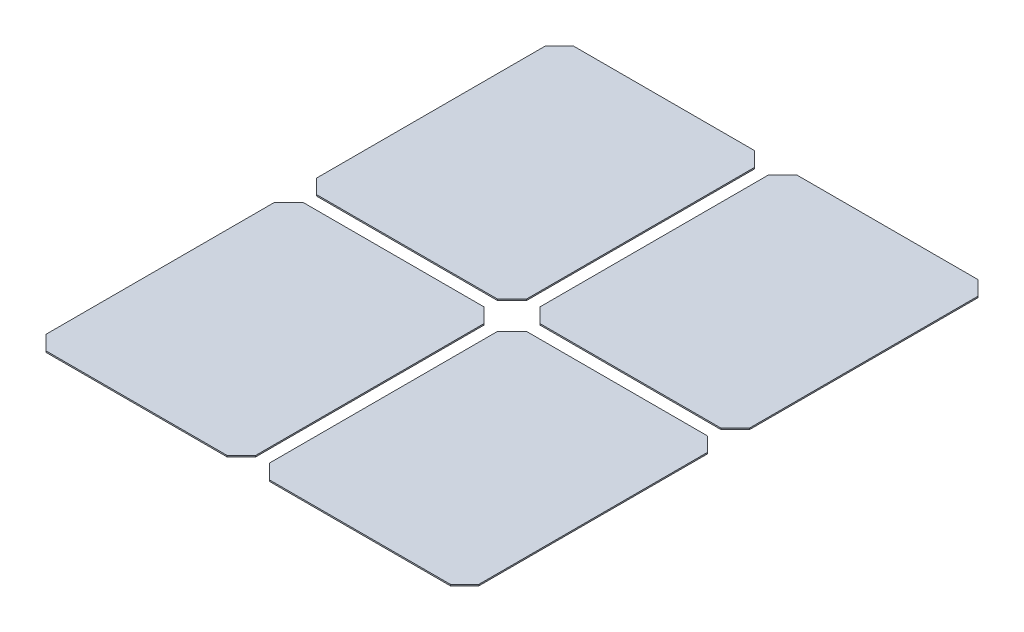
ISO-10303-21;
HEADER;
FILE_DESCRIPTION(('STEP AP214'),'2;1');
FILE_NAME('part.step','',(''),(''),'','','');
FILE_SCHEMA(('AUTOMOTIVE_DESIGN { 1 0 10303 214 1 1 1 1 }'));
ENDSEC;
DATA;
#1=APPLICATION_CONTEXT('core data for automotive mechanical design processes');
#2=APPLICATION_PROTOCOL_DEFINITION('international standard','automotive_design',2000,#1);
#3=PRODUCT_CONTEXT('',#1,'mechanical');
#4=PRODUCT('Part','Part','',(#3));
#5=PRODUCT_RELATED_PRODUCT_CATEGORY('part','',(#4));
#6=PRODUCT_DEFINITION_FORMATION('','',#4);
#7=PRODUCT_DEFINITION_CONTEXT('part definition',#1,'design');
#8=PRODUCT_DEFINITION('design','',#6,#7);
#9=PRODUCT_DEFINITION_SHAPE('','',#8);
#10=(LENGTH_UNIT() NAMED_UNIT(*) SI_UNIT(.MILLI.,.METRE.));
#11=(NAMED_UNIT(*) PLANE_ANGLE_UNIT() SI_UNIT($,.RADIAN.));
#12=(NAMED_UNIT(*) SI_UNIT($,.STERADIAN.) SOLID_ANGLE_UNIT());
#13=UNCERTAINTY_MEASURE_WITH_UNIT(LENGTH_MEASURE(1.E-05),#10,'distance_accuracy_value','');
#14=(GEOMETRIC_REPRESENTATION_CONTEXT(3) GLOBAL_UNCERTAINTY_ASSIGNED_CONTEXT((#13)) GLOBAL_UNIT_ASSIGNED_CONTEXT((#10,
#11,#12)) REPRESENTATION_CONTEXT('',''));
#15=CARTESIAN_POINT('',(0.,0.,0.));
#16=DIRECTION('',(0.,0.,1.));
#17=DIRECTION('',(1.,0.,0.));
#18=AXIS2_PLACEMENT_3D('',#15,#16,#17);
#19=CARTESIAN_POINT('',(-168.000000000001,1.,-233.606601717798));
#20=DIRECTION('',(1.,0.,0.));
#21=DIRECTION('',(0.,0.,-1.));
#22=AXIS2_PLACEMENT_3D('',#19,#20,#21);
#23=PLANE('',#22);
#24=DIRECTION('',(0.,0.,1.));
#25=VECTOR('',#24,1.);
#26=CARTESIAN_POINT('',(-168.000000000001,0.,-233.606601717798));
#27=LINE('',#26,#25);
#28=CARTESIAN_POINT('',(-168.000000000001,0.,-402.393398282201));
#29=VERTEX_POINT('',#28);
#30=CARTESIAN_POINT('',(-168.000000000001,0.,-233.606601717798));
#31=VERTEX_POINT('',#30);
#32=EDGE_CURVE('E139',#29,#31,#27,.T.);
#33=ORIENTED_EDGE('',*,*,#32,.T.);
#34=DIRECTION('',(0.,-1.,0.));
#35=VECTOR('',#34,1.);
#36=CARTESIAN_POINT('',(-168.000000000001,1.,-233.606601717798));
#37=LINE('',#36,#35);
#38=CARTESIAN_POINT('',(-168.000000000001,1.,-233.606601717798));
#39=VERTEX_POINT('',#38);
#40=EDGE_CURVE('E12',#39,#31,#37,.T.);
#41=ORIENTED_EDGE('',*,*,#40,.F.);
#42=DIRECTION('',(0.,0.,1.));
#43=VECTOR('',#42,1.);
#44=CARTESIAN_POINT('',(-168.000000000001,1.,-233.606601717798));
#45=LINE('',#44,#43);
#46=CARTESIAN_POINT('',(-168.000000000001,1.,-402.393398282201));
#47=VERTEX_POINT('',#46);
#48=EDGE_CURVE('E153',#47,#39,#45,.T.);
#49=ORIENTED_EDGE('',*,*,#48,.F.);
#50=DIRECTION('',(0.,-1.,0.));
#51=VECTOR('',#50,1.);
#52=CARTESIAN_POINT('',(-168.000000000001,1.,-402.393398282201));
#53=LINE('',#52,#51);
#54=EDGE_CURVE('E135',#47,#29,#53,.T.);
#55=ORIENTED_EDGE('',*,*,#54,.T.);
#56=EDGE_LOOP('',(#33,#41,#49,#55));
#57=FACE_BOUND('',#56,.T.);
#58=ADVANCED_FACE('F43',(#57),#23,.F.);
#59=CARTESIAN_POINT('',(-157.393398282203,1.,-223.));
#60=DIRECTION('',(0.70710678118655,0.,-0.707106781186545));
#61=DIRECTION('',(-0.707106781186545,0.,-0.70710678118655));
#62=AXIS2_PLACEMENT_3D('',#59,#60,#61);
#63=PLANE('',#62);
#64=DIRECTION('',(0.707106781186545,0.,0.70710678118655));
#65=VECTOR('',#64,1.);
#66=CARTESIAN_POINT('',(-157.393398282203,0.,-223.));
#67=LINE('',#66,#65);
#68=CARTESIAN_POINT('',(-157.393398282203,0.,-223.));
#69=VERTEX_POINT('',#68);
#70=EDGE_CURVE('E142',#31,#69,#67,.T.);
#71=ORIENTED_EDGE('',*,*,#70,.T.);
#72=DIRECTION('',(0.,-1.,0.));
#73=VECTOR('',#72,1.);
#74=CARTESIAN_POINT('',(-157.393398282203,1.,-223.));
#75=LINE('',#74,#73);
#76=CARTESIAN_POINT('',(-157.393398282203,1.,-223.));
#77=VERTEX_POINT('',#76);
#78=EDGE_CURVE('E51',#77,#69,#75,.T.);
#79=ORIENTED_EDGE('',*,*,#78,.F.);
#80=DIRECTION('',(0.707106781186545,0.,0.70710678118655));
#81=VECTOR('',#80,1.);
#82=CARTESIAN_POINT('',(-157.393398282203,1.,-223.));
#83=LINE('',#82,#81);
#84=EDGE_CURVE('E102',#39,#77,#83,.T.);
#85=ORIENTED_EDGE('',*,*,#84,.F.);
#86=ORIENTED_EDGE('',*,*,#40,.T.);
#87=EDGE_LOOP('',(#71,#79,#85,#86));
#88=FACE_BOUND('',#87,.T.);
#89=ADVANCED_FACE('F188',(#88),#63,.F.);
#90=CARTESIAN_POINT('',(-23.606601717799,1.,-223.));
#91=DIRECTION('',(0.,0.,-1.));
#92=DIRECTION('',(-1.,0.,0.));
#93=AXIS2_PLACEMENT_3D('',#90,#91,#92);
#94=PLANE('',#93);
#95=DIRECTION('',(1.,0.,0.));
#96=VECTOR('',#95,1.);
#97=CARTESIAN_POINT('',(-23.606601717799,0.,-223.));
#98=LINE('',#97,#96);
#99=CARTESIAN_POINT('',(-23.606601717799,0.,-223.));
#100=VERTEX_POINT('',#99);
#101=EDGE_CURVE('E144',#69,#100,#98,.T.);
#102=ORIENTED_EDGE('',*,*,#101,.T.);
#103=DIRECTION('',(0.,-1.,0.));
#104=VECTOR('',#103,1.);
#105=CARTESIAN_POINT('',(-23.606601717799,1.,-223.));
#106=LINE('',#105,#104);
#107=CARTESIAN_POINT('',(-23.606601717799,1.,-223.));
#108=VERTEX_POINT('',#107);
#109=EDGE_CURVE('E160',#108,#100,#106,.T.);
#110=ORIENTED_EDGE('',*,*,#109,.F.);
#111=DIRECTION('',(1.,0.,0.));
#112=VECTOR('',#111,1.);
#113=CARTESIAN_POINT('',(-23.606601717799,1.,-223.));
#114=LINE('',#113,#112);
#115=EDGE_CURVE('E168',#77,#108,#114,.T.);
#116=ORIENTED_EDGE('',*,*,#115,.F.);
#117=ORIENTED_EDGE('',*,*,#78,.T.);
#118=EDGE_LOOP('',(#102,#110,#116,#117));
#119=FACE_BOUND('',#118,.T.);
#120=ADVANCED_FACE('F166',(#119),#94,.F.);
#121=CARTESIAN_POINT('',(-13.0000000000007,1.,-233.606601717798));
#122=DIRECTION('',(-0.707106781186542,0.,-0.707106781186553));
#123=DIRECTION('',(-0.707106781186553,0.,0.707106781186542));
#124=AXIS2_PLACEMENT_3D('',#121,#122,#123);
#125=PLANE('',#124);
#126=DIRECTION('',(0.707106781186553,0.,-0.707106781186542));
#127=VECTOR('',#126,1.);
#128=CARTESIAN_POINT('',(-13.0000000000007,0.,-233.606601717798));
#129=LINE('',#128,#127);
#130=CARTESIAN_POINT('',(-13.0000000000007,0.,-233.606601717798));
#131=VERTEX_POINT('',#130);
#132=EDGE_CURVE('E146',#100,#131,#129,.T.);
#133=ORIENTED_EDGE('',*,*,#132,.T.);
#134=DIRECTION('',(0.,-1.,0.));
#135=VECTOR('',#134,1.);
#136=CARTESIAN_POINT('',(-13.0000000000007,1.,-233.606601717798));
#137=LINE('',#136,#135);
#138=CARTESIAN_POINT('',(-13.0000000000007,1.,-233.606601717798));
#139=VERTEX_POINT('',#138);
#140=EDGE_CURVE('E157',#139,#131,#137,.T.);
#141=ORIENTED_EDGE('',*,*,#140,.F.);
#142=DIRECTION('',(0.707106781186553,0.,-0.707106781186542));
#143=VECTOR('',#142,1.);
#144=CARTESIAN_POINT('',(-13.0000000000007,1.,-233.606601717798));
#145=LINE('',#144,#143);
#146=EDGE_CURVE('E180',#108,#139,#145,.T.);
#147=ORIENTED_EDGE('',*,*,#146,.F.);
#148=ORIENTED_EDGE('',*,*,#109,.T.);
#149=EDGE_LOOP('',(#133,#141,#147,#148));
#150=FACE_BOUND('',#149,.T.);
#151=ADVANCED_FACE('F176',(#150),#125,.F.);
#152=CARTESIAN_POINT('',(-13.0000000000007,1.,-402.393398282202));
#153=DIRECTION('',(-1.,0.,0.));
#154=DIRECTION('',(0.,0.,1.));
#155=AXIS2_PLACEMENT_3D('',#152,#153,#154);
#156=PLANE('',#155);
#157=DIRECTION('',(0.,0.,-1.));
#158=VECTOR('',#157,1.);
#159=CARTESIAN_POINT('',(-13.0000000000007,0.,-402.393398282202));
#160=LINE('',#159,#158);
#161=CARTESIAN_POINT('',(-13.0000000000007,0.,-402.393398282202));
#162=VERTEX_POINT('',#161);
#163=EDGE_CURVE('E148',#131,#162,#160,.T.);
#164=ORIENTED_EDGE('',*,*,#163,.T.);
#165=DIRECTION('',(0.,-1.,0.));
#166=VECTOR('',#165,1.);
#167=CARTESIAN_POINT('',(-13.0000000000007,1.,-402.393398282202));
#168=LINE('',#167,#166);
#169=CARTESIAN_POINT('',(-13.0000000000007,1.,-402.393398282202));
#170=VERTEX_POINT('',#169);
#171=EDGE_CURVE('E130',#170,#162,#168,.T.);
#172=ORIENTED_EDGE('',*,*,#171,.F.);
#173=DIRECTION('',(0.,0.,-1.));
#174=VECTOR('',#173,1.);
#175=CARTESIAN_POINT('',(-13.0000000000007,1.,-402.393398282202));
#176=LINE('',#175,#174);
#177=EDGE_CURVE('E121',#139,#170,#176,.T.);
#178=ORIENTED_EDGE('',*,*,#177,.F.);
#179=ORIENTED_EDGE('',*,*,#140,.T.);
#180=EDGE_LOOP('',(#164,#172,#178,#179));
#181=FACE_BOUND('',#180,.T.);
#182=ADVANCED_FACE('F179',(#181),#156,.F.);
#183=CARTESIAN_POINT('',(-23.6066017177989,1.,-413.));
#184=DIRECTION('',(-0.70710678118654,0.,0.707106781186556));
#185=DIRECTION('',(0.707106781186556,0.,0.70710678118654));
#186=AXIS2_PLACEMENT_3D('',#183,#184,#185);
#187=PLANE('',#186);
#188=DIRECTION('',(-0.707106781186556,0.,-0.70710678118654));
#189=VECTOR('',#188,1.);
#190=CARTESIAN_POINT('',(-23.6066017177989,0.,-413.));
#191=LINE('',#190,#189);
#192=CARTESIAN_POINT('',(-23.6066017177989,0.,-413.));
#193=VERTEX_POINT('',#192);
#194=EDGE_CURVE('E129',#162,#193,#191,.T.);
#195=ORIENTED_EDGE('',*,*,#194,.T.);
#196=DIRECTION('',(0.,-1.,0.));
#197=VECTOR('',#196,1.);
#198=CARTESIAN_POINT('',(-23.6066017177989,1.,-413.));
#199=LINE('',#198,#197);
#200=CARTESIAN_POINT('',(-23.6066017177989,1.,-413.));
#201=VERTEX_POINT('',#200);
#202=EDGE_CURVE('E126',#201,#193,#199,.T.);
#203=ORIENTED_EDGE('',*,*,#202,.F.);
#204=DIRECTION('',(-0.707106781186556,0.,-0.70710678118654));
#205=VECTOR('',#204,1.);
#206=CARTESIAN_POINT('',(-23.6066017177989,1.,-413.));
#207=LINE('',#206,#205);
#208=EDGE_CURVE('E115',#170,#201,#207,.T.);
#209=ORIENTED_EDGE('',*,*,#208,.F.);
#210=ORIENTED_EDGE('',*,*,#171,.T.);
#211=EDGE_LOOP('',(#195,#203,#209,#210));
#212=FACE_BOUND('',#211,.T.);
#213=ADVANCED_FACE('F127',(#212),#187,.F.);
#214=CARTESIAN_POINT('',(-157.393398282202,1.,-413.));
#215=DIRECTION('',(0.,0.,1.));
#216=DIRECTION('',(1.,0.,0.));
#217=AXIS2_PLACEMENT_3D('',#214,#215,#216);
#218=PLANE('',#217);
#219=DIRECTION('',(-1.,0.,0.));
#220=VECTOR('',#219,1.);
#221=CARTESIAN_POINT('',(-157.393398282202,0.,-413.));
#222=LINE('',#221,#220);
#223=CARTESIAN_POINT('',(-157.393398282202,0.,-413.));
#224=VERTEX_POINT('',#223);
#225=EDGE_CURVE('E88',#193,#224,#222,.T.);
#226=ORIENTED_EDGE('',*,*,#225,.T.);
#227=DIRECTION('',(0.,-1.,0.));
#228=VECTOR('',#227,1.);
#229=CARTESIAN_POINT('',(-157.393398282202,1.,-413.));
#230=LINE('',#229,#228);
#231=CARTESIAN_POINT('',(-157.393398282202,1.,-413.));
#232=VERTEX_POINT('',#231);
#233=EDGE_CURVE('E131',#232,#224,#230,.T.);
#234=ORIENTED_EDGE('',*,*,#233,.F.);
#235=DIRECTION('',(-1.,0.,0.));
#236=VECTOR('',#235,1.);
#237=CARTESIAN_POINT('',(-157.393398282202,1.,-413.));
#238=LINE('',#237,#236);
#239=EDGE_CURVE('E119',#201,#232,#238,.T.);
#240=ORIENTED_EDGE('',*,*,#239,.F.);
#241=ORIENTED_EDGE('',*,*,#202,.T.);
#242=EDGE_LOOP('',(#226,#234,#240,#241));
#243=FACE_BOUND('',#242,.T.);
#244=ADVANCED_FACE('F133',(#243),#218,.F.);
#245=CARTESIAN_POINT('',(-168.000000000001,1.,-402.393398282201));
#246=DIRECTION('',(0.707106781186573,0.,0.707106781186522));
#247=DIRECTION('',(0.707106781186522,0.,-0.707106781186573));
#248=AXIS2_PLACEMENT_3D('',#245,#246,#247);
#249=PLANE('',#248);
#250=DIRECTION('',(-0.707106781186522,0.,0.707106781186573));
#251=VECTOR('',#250,1.);
#252=CARTESIAN_POINT('',(-168.000000000001,0.,-402.393398282201));
#253=LINE('',#252,#251);
#254=EDGE_CURVE('E94',#224,#29,#253,.T.);
#255=ORIENTED_EDGE('',*,*,#254,.T.);
#256=ORIENTED_EDGE('',*,*,#54,.F.);
#257=DIRECTION('',(-0.707106781186522,0.,0.707106781186573));
#258=VECTOR('',#257,1.);
#259=CARTESIAN_POINT('',(-168.000000000001,1.,-402.393398282201));
#260=LINE('',#259,#258);
#261=EDGE_CURVE('E59',#232,#47,#260,.T.);
#262=ORIENTED_EDGE('',*,*,#261,.F.);
#263=ORIENTED_EDGE('',*,*,#233,.T.);
#264=EDGE_LOOP('',(#255,#256,#262,#263));
#265=FACE_BOUND('',#264,.T.);
#266=ADVANCED_FACE('F204',(#265),#249,.F.);
#267=CARTESIAN_POINT('',(0.,1.,0.));
#268=DIRECTION('',(0.,-1.,0.));
#269=DIRECTION('',(0.,0.,-1.));
#270=AXIS2_PLACEMENT_3D('',#267,#268,#269);
#271=PLANE('',#270);
#272=ORIENTED_EDGE('',*,*,#48,.T.);
#273=ORIENTED_EDGE('',*,*,#84,.T.);
#274=ORIENTED_EDGE('',*,*,#115,.T.);
#275=ORIENTED_EDGE('',*,*,#146,.T.);
#276=ORIENTED_EDGE('',*,*,#177,.T.);
#277=ORIENTED_EDGE('',*,*,#208,.T.);
#278=ORIENTED_EDGE('',*,*,#239,.T.);
#279=ORIENTED_EDGE('',*,*,#261,.T.);
#280=EDGE_LOOP('',(#272,#273,#274,#275,#276,#277,#278,#279));
#281=FACE_BOUND('',#280,.T.);
#282=ADVANCED_FACE('F117',(#281),#271,.F.);
#283=CARTESIAN_POINT('',(0.,0.,0.));
#284=DIRECTION('',(0.,-1.,0.));
#285=DIRECTION('',(0.,0.,-1.));
#286=AXIS2_PLACEMENT_3D('',#283,#284,#285);
#287=PLANE('',#286);
#288=ORIENTED_EDGE('',*,*,#32,.F.);
#289=ORIENTED_EDGE('',*,*,#254,.F.);
#290=ORIENTED_EDGE('',*,*,#225,.F.);
#291=ORIENTED_EDGE('',*,*,#194,.F.);
#292=ORIENTED_EDGE('',*,*,#163,.F.);
#293=ORIENTED_EDGE('',*,*,#132,.F.);
#294=ORIENTED_EDGE('',*,*,#101,.F.);
#295=ORIENTED_EDGE('',*,*,#70,.F.);
#296=EDGE_LOOP('',(#288,#289,#290,#291,#292,#293,#294,#295));
#297=FACE_BOUND('',#296,.T.);
#298=ADVANCED_FACE('F172',(#297),#287,.T.);
#299=CLOSED_SHELL('',(#58,#89,#120,#151,#182,#213,#244,#266,#282,#298));
#300=MANIFOLD_SOLID_BREP('B2',#299);
#301=CARTESIAN_POINT('',(-333.000000000001,1.,-233.606601717797));
#302=DIRECTION('',(1.,0.,0.));
#303=DIRECTION('',(0.,0.,-1.));
#304=AXIS2_PLACEMENT_3D('',#301,#302,#303);
#305=PLANE('',#304);
#306=DIRECTION('',(0.,0.,1.));
#307=VECTOR('',#306,1.);
#308=CARTESIAN_POINT('',(-333.000000000001,0.,-233.606601717797));
#309=LINE('',#308,#307);
#310=CARTESIAN_POINT('',(-333.000000000001,0.,-402.3933982822));
#311=VERTEX_POINT('',#310);
#312=CARTESIAN_POINT('',(-333.000000000001,0.,-233.606601717797));
#313=VERTEX_POINT('',#312);
#314=EDGE_CURVE('E376',#311,#313,#309,.T.);
#315=ORIENTED_EDGE('',*,*,#314,.T.);
#316=DIRECTION('',(0.,-1.,0.));
#317=VECTOR('',#316,1.);
#318=CARTESIAN_POINT('',(-333.000000000001,1.,-233.606601717797));
#319=LINE('',#318,#317);
#320=CARTESIAN_POINT('',(-333.000000000001,1.,-233.606601717797));
#321=VERTEX_POINT('',#320);
#322=EDGE_CURVE('E41',#321,#313,#319,.T.);
#323=ORIENTED_EDGE('',*,*,#322,.F.);
#324=DIRECTION('',(0.,0.,1.));
#325=VECTOR('',#324,1.);
#326=CARTESIAN_POINT('',(-333.000000000001,1.,-233.606601717797));
#327=LINE('',#326,#325);
#328=CARTESIAN_POINT('',(-333.000000000001,1.,-402.3933982822));
#329=VERTEX_POINT('',#328);
#330=EDGE_CURVE('E390',#329,#321,#327,.T.);
#331=ORIENTED_EDGE('',*,*,#330,.F.);
#332=DIRECTION('',(0.,-1.,0.));
#333=VECTOR('',#332,1.);
#334=CARTESIAN_POINT('',(-333.000000000001,1.,-402.3933982822));
#335=LINE('',#334,#333);
#336=EDGE_CURVE('E372',#329,#311,#335,.T.);
#337=ORIENTED_EDGE('',*,*,#336,.T.);
#338=EDGE_LOOP('',(#315,#323,#331,#337));
#339=FACE_BOUND('',#338,.T.);
#340=ADVANCED_FACE('F280',(#339),#305,.F.);
#341=CARTESIAN_POINT('',(-322.393398282202,1.,-222.999999999999));
#342=DIRECTION('',(0.707106781186551,0.,-0.707106781186544));
#343=DIRECTION('',(-0.707106781186544,0.,-0.707106781186551));
#344=AXIS2_PLACEMENT_3D('',#341,#342,#343);
#345=PLANE('',#344);
#346=DIRECTION('',(0.707106781186544,0.,0.707106781186551));
#347=VECTOR('',#346,1.);
#348=CARTESIAN_POINT('',(-322.393398282202,0.,-222.999999999999));
#349=LINE('',#348,#347);
#350=CARTESIAN_POINT('',(-322.393398282202,0.,-222.999999999999));
#351=VERTEX_POINT('',#350);
#352=EDGE_CURVE('E379',#313,#351,#349,.T.);
#353=ORIENTED_EDGE('',*,*,#352,.T.);
#354=DIRECTION('',(0.,-1.,0.));
#355=VECTOR('',#354,1.);
#356=CARTESIAN_POINT('',(-322.393398282202,1.,-222.999999999999));
#357=LINE('',#356,#355);
#358=CARTESIAN_POINT('',(-322.393398282202,1.,-222.999999999999));
#359=VERTEX_POINT('',#358);
#360=EDGE_CURVE('E288',#359,#351,#357,.T.);
#361=ORIENTED_EDGE('',*,*,#360,.F.);
#362=DIRECTION('',(0.707106781186544,0.,0.707106781186551));
#363=VECTOR('',#362,1.);
#364=CARTESIAN_POINT('',(-322.393398282202,1.,-222.999999999999));
#365=LINE('',#364,#363);
#366=EDGE_CURVE('E339',#321,#359,#365,.T.);
#367=ORIENTED_EDGE('',*,*,#366,.F.);
#368=ORIENTED_EDGE('',*,*,#322,.T.);
#369=EDGE_LOOP('',(#353,#361,#367,#368));
#370=FACE_BOUND('',#369,.T.);
#371=ADVANCED_FACE('F425',(#370),#345,.F.);
#372=CARTESIAN_POINT('',(-188.606601717799,1.,-222.999999999999));
#373=DIRECTION('',(0.,0.,-1.));
#374=DIRECTION('',(-1.,0.,0.));
#375=AXIS2_PLACEMENT_3D('',#372,#373,#374);
#376=PLANE('',#375);
#377=DIRECTION('',(1.,0.,0.));
#378=VECTOR('',#377,1.);
#379=CARTESIAN_POINT('',(-188.606601717799,0.,-222.999999999999));
#380=LINE('',#379,#378);
#381=CARTESIAN_POINT('',(-188.606601717799,0.,-222.999999999999));
#382=VERTEX_POINT('',#381);
#383=EDGE_CURVE('E381',#351,#382,#380,.T.);
#384=ORIENTED_EDGE('',*,*,#383,.T.);
#385=DIRECTION('',(0.,-1.,0.));
#386=VECTOR('',#385,1.);
#387=CARTESIAN_POINT('',(-188.606601717799,1.,-222.999999999999));
#388=LINE('',#387,#386);
#389=CARTESIAN_POINT('',(-188.606601717799,1.,-222.999999999999));
#390=VERTEX_POINT('',#389);
#391=EDGE_CURVE('E397',#390,#382,#388,.T.);
#392=ORIENTED_EDGE('',*,*,#391,.F.);
#393=DIRECTION('',(1.,0.,0.));
#394=VECTOR('',#393,1.);
#395=CARTESIAN_POINT('',(-188.606601717799,1.,-222.999999999999));
#396=LINE('',#395,#394);
#397=EDGE_CURVE('E405',#359,#390,#396,.T.);
#398=ORIENTED_EDGE('',*,*,#397,.F.);
#399=ORIENTED_EDGE('',*,*,#360,.T.);
#400=EDGE_LOOP('',(#384,#392,#398,#399));
#401=FACE_BOUND('',#400,.T.);
#402=ADVANCED_FACE('F403',(#401),#376,.F.);
#403=CARTESIAN_POINT('',(-178.000000000001,1.,-233.606601717797));
#404=DIRECTION('',(-0.707106781186542,0.,-0.707106781186553));
#405=DIRECTION('',(-0.707106781186553,0.,0.707106781186542));
#406=AXIS2_PLACEMENT_3D('',#403,#404,#405);
#407=PLANE('',#406);
#408=DIRECTION('',(0.707106781186553,0.,-0.707106781186542));
#409=VECTOR('',#408,1.);
#410=CARTESIAN_POINT('',(-178.000000000001,0.,-233.606601717797));
#411=LINE('',#410,#409);
#412=CARTESIAN_POINT('',(-178.000000000001,0.,-233.606601717797));
#413=VERTEX_POINT('',#412);
#414=EDGE_CURVE('E383',#382,#413,#411,.T.);
#415=ORIENTED_EDGE('',*,*,#414,.T.);
#416=DIRECTION('',(0.,-1.,0.));
#417=VECTOR('',#416,1.);
#418=CARTESIAN_POINT('',(-178.000000000001,1.,-233.606601717797));
#419=LINE('',#418,#417);
#420=CARTESIAN_POINT('',(-178.000000000001,1.,-233.606601717797));
#421=VERTEX_POINT('',#420);
#422=EDGE_CURVE('E394',#421,#413,#419,.T.);
#423=ORIENTED_EDGE('',*,*,#422,.F.);
#424=DIRECTION('',(0.707106781186553,0.,-0.707106781186542));
#425=VECTOR('',#424,1.);
#426=CARTESIAN_POINT('',(-178.000000000001,1.,-233.606601717797));
#427=LINE('',#426,#425);
#428=EDGE_CURVE('E417',#390,#421,#427,.T.);
#429=ORIENTED_EDGE('',*,*,#428,.F.);
#430=ORIENTED_EDGE('',*,*,#391,.T.);
#431=EDGE_LOOP('',(#415,#423,#429,#430));
#432=FACE_BOUND('',#431,.T.);
#433=ADVANCED_FACE('F413',(#432),#407,.F.);
#434=CARTESIAN_POINT('',(-178.000000000001,1.,-402.393398282201));
#435=DIRECTION('',(-1.,0.,0.));
#436=DIRECTION('',(0.,0.,1.));
#437=AXIS2_PLACEMENT_3D('',#434,#435,#436);
#438=PLANE('',#437);
#439=DIRECTION('',(0.,0.,-1.));
#440=VECTOR('',#439,1.);
#441=CARTESIAN_POINT('',(-178.000000000001,0.,-402.393398282201));
#442=LINE('',#441,#440);
#443=CARTESIAN_POINT('',(-178.000000000001,0.,-402.393398282201));
#444=VERTEX_POINT('',#443);
#445=EDGE_CURVE('E385',#413,#444,#442,.T.);
#446=ORIENTED_EDGE('',*,*,#445,.T.);
#447=DIRECTION('',(0.,-1.,0.));
#448=VECTOR('',#447,1.);
#449=CARTESIAN_POINT('',(-178.000000000001,1.,-402.393398282201));
#450=LINE('',#449,#448);
#451=CARTESIAN_POINT('',(-178.000000000001,1.,-402.393398282201));
#452=VERTEX_POINT('',#451);
#453=EDGE_CURVE('E367',#452,#444,#450,.T.);
#454=ORIENTED_EDGE('',*,*,#453,.F.);
#455=DIRECTION('',(0.,0.,-1.));
#456=VECTOR('',#455,1.);
#457=CARTESIAN_POINT('',(-178.000000000001,1.,-402.393398282201));
#458=LINE('',#457,#456);
#459=EDGE_CURVE('E358',#421,#452,#458,.T.);
#460=ORIENTED_EDGE('',*,*,#459,.F.);
#461=ORIENTED_EDGE('',*,*,#422,.T.);
#462=EDGE_LOOP('',(#446,#454,#460,#461));
#463=FACE_BOUND('',#462,.T.);
#464=ADVANCED_FACE('F416',(#463),#438,.F.);
#465=CARTESIAN_POINT('',(-188.606601717799,1.,-412.999999999999));
#466=DIRECTION('',(-0.707106781186539,0.,0.707106781186556));
#467=DIRECTION('',(0.707106781186556,0.,0.707106781186539));
#468=AXIS2_PLACEMENT_3D('',#465,#466,#467);
#469=PLANE('',#468);
#470=DIRECTION('',(-0.707106781186556,0.,-0.707106781186539));
#471=VECTOR('',#470,1.);
#472=CARTESIAN_POINT('',(-188.606601717799,0.,-412.999999999999));
#473=LINE('',#472,#471);
#474=CARTESIAN_POINT('',(-188.606601717799,0.,-412.999999999999));
#475=VERTEX_POINT('',#474);
#476=EDGE_CURVE('E366',#444,#475,#473,.T.);
#477=ORIENTED_EDGE('',*,*,#476,.T.);
#478=DIRECTION('',(0.,-1.,0.));
#479=VECTOR('',#478,1.);
#480=CARTESIAN_POINT('',(-188.606601717799,1.,-412.999999999999));
#481=LINE('',#480,#479);
#482=CARTESIAN_POINT('',(-188.606601717799,1.,-412.999999999999));
#483=VERTEX_POINT('',#482);
#484=EDGE_CURVE('E363',#483,#475,#481,.T.);
#485=ORIENTED_EDGE('',*,*,#484,.F.);
#486=DIRECTION('',(-0.707106781186556,0.,-0.707106781186539));
#487=VECTOR('',#486,1.);
#488=CARTESIAN_POINT('',(-188.606601717799,1.,-412.999999999999));
#489=LINE('',#488,#487);
#490=EDGE_CURVE('E352',#452,#483,#489,.T.);
#491=ORIENTED_EDGE('',*,*,#490,.F.);
#492=ORIENTED_EDGE('',*,*,#453,.T.);
#493=EDGE_LOOP('',(#477,#485,#491,#492));
#494=FACE_BOUND('',#493,.T.);
#495=ADVANCED_FACE('F364',(#494),#469,.F.);
#496=CARTESIAN_POINT('',(-322.393398282202,1.,-412.999999999999));
#497=DIRECTION('',(0.,0.,1.));
#498=DIRECTION('',(1.,0.,0.));
#499=AXIS2_PLACEMENT_3D('',#496,#497,#498);
#500=PLANE('',#499);
#501=DIRECTION('',(-1.,0.,0.));
#502=VECTOR('',#501,1.);
#503=CARTESIAN_POINT('',(-322.393398282202,0.,-412.999999999999));
#504=LINE('',#503,#502);
#505=CARTESIAN_POINT('',(-322.393398282202,0.,-412.999999999999));
#506=VERTEX_POINT('',#505);
#507=EDGE_CURVE('E325',#475,#506,#504,.T.);
#508=ORIENTED_EDGE('',*,*,#507,.T.);
#509=DIRECTION('',(0.,-1.,0.));
#510=VECTOR('',#509,1.);
#511=CARTESIAN_POINT('',(-322.393398282202,1.,-412.999999999999));
#512=LINE('',#511,#510);
#513=CARTESIAN_POINT('',(-322.393398282202,1.,-412.999999999999));
#514=VERTEX_POINT('',#513);
#515=EDGE_CURVE('E368',#514,#506,#512,.T.);
#516=ORIENTED_EDGE('',*,*,#515,.F.);
#517=DIRECTION('',(-1.,0.,0.));
#518=VECTOR('',#517,1.);
#519=CARTESIAN_POINT('',(-322.393398282202,1.,-412.999999999999));
#520=LINE('',#519,#518);
#521=EDGE_CURVE('E356',#483,#514,#520,.T.);
#522=ORIENTED_EDGE('',*,*,#521,.F.);
#523=ORIENTED_EDGE('',*,*,#484,.T.);
#524=EDGE_LOOP('',(#508,#516,#522,#523));
#525=FACE_BOUND('',#524,.T.);
#526=ADVANCED_FACE('F370',(#525),#500,.F.);
#527=CARTESIAN_POINT('',(-333.000000000001,1.,-402.3933982822));
#528=DIRECTION('',(0.707106781186575,0.,0.70710678118652));
#529=DIRECTION('',(0.70710678118652,0.,-0.707106781186575));
#530=AXIS2_PLACEMENT_3D('',#527,#528,#529);
#531=PLANE('',#530);
#532=DIRECTION('',(-0.70710678118652,0.,0.707106781186575));
#533=VECTOR('',#532,1.);
#534=CARTESIAN_POINT('',(-333.000000000001,0.,-402.3933982822));
#535=LINE('',#534,#533);
#536=EDGE_CURVE('E331',#506,#311,#535,.T.);
#537=ORIENTED_EDGE('',*,*,#536,.T.);
#538=ORIENTED_EDGE('',*,*,#336,.F.);
#539=DIRECTION('',(-0.70710678118652,0.,0.707106781186575));
#540=VECTOR('',#539,1.);
#541=CARTESIAN_POINT('',(-333.000000000001,1.,-402.3933982822));
#542=LINE('',#541,#540);
#543=EDGE_CURVE('E296',#514,#329,#542,.T.);
#544=ORIENTED_EDGE('',*,*,#543,.F.);
#545=ORIENTED_EDGE('',*,*,#515,.T.);
#546=EDGE_LOOP('',(#537,#538,#544,#545));
#547=FACE_BOUND('',#546,.T.);
#548=ADVANCED_FACE('F441',(#547),#531,.F.);
#549=CARTESIAN_POINT('',(0.,1.,0.));
#550=DIRECTION('',(0.,-1.,0.));
#551=DIRECTION('',(0.,0.,-1.));
#552=AXIS2_PLACEMENT_3D('',#549,#550,#551);
#553=PLANE('',#552);
#554=ORIENTED_EDGE('',*,*,#330,.T.);
#555=ORIENTED_EDGE('',*,*,#366,.T.);
#556=ORIENTED_EDGE('',*,*,#397,.T.);
#557=ORIENTED_EDGE('',*,*,#428,.T.);
#558=ORIENTED_EDGE('',*,*,#459,.T.);
#559=ORIENTED_EDGE('',*,*,#490,.T.);
#560=ORIENTED_EDGE('',*,*,#521,.T.);
#561=ORIENTED_EDGE('',*,*,#543,.T.);
#562=EDGE_LOOP('',(#554,#555,#556,#557,#558,#559,#560,#561));
#563=FACE_BOUND('',#562,.T.);
#564=ADVANCED_FACE('F354',(#563),#553,.F.);
#565=CARTESIAN_POINT('',(0.,0.,0.));
#566=DIRECTION('',(0.,-1.,0.));
#567=DIRECTION('',(0.,0.,-1.));
#568=AXIS2_PLACEMENT_3D('',#565,#566,#567);
#569=PLANE('',#568);
#570=ORIENTED_EDGE('',*,*,#314,.F.);
#571=ORIENTED_EDGE('',*,*,#536,.F.);
#572=ORIENTED_EDGE('',*,*,#507,.F.);
#573=ORIENTED_EDGE('',*,*,#476,.F.);
#574=ORIENTED_EDGE('',*,*,#445,.F.);
#575=ORIENTED_EDGE('',*,*,#414,.F.);
#576=ORIENTED_EDGE('',*,*,#383,.F.);
#577=ORIENTED_EDGE('',*,*,#352,.F.);
#578=EDGE_LOOP('',(#570,#571,#572,#573,#574,#575,#576,#577));
#579=FACE_BOUND('',#578,.T.);
#580=ADVANCED_FACE('F409',(#579),#569,.T.);
#581=CLOSED_SHELL('',(#340,#371,#402,#433,#464,#495,#526,#548,#564,#580));
#582=MANIFOLD_SOLID_BREP('B6',#581);
#583=CARTESIAN_POINT('',(-333.,1.,-33.6066017177971));
#584=DIRECTION('',(1.,0.,0.));
#585=DIRECTION('',(0.,0.,-1.));
#586=AXIS2_PLACEMENT_3D('',#583,#584,#585);
#587=PLANE('',#586);
#588=DIRECTION('',(0.,0.,1.));
#589=VECTOR('',#588,1.);
#590=CARTESIAN_POINT('',(-333.,0.,-33.6066017177971));
#591=LINE('',#590,#589);
#592=CARTESIAN_POINT('',(-333.,0.,-202.3933982822));
#593=VERTEX_POINT('',#592);
#594=CARTESIAN_POINT('',(-333.,0.,-33.6066017177971));
#595=VERTEX_POINT('',#594);
#596=EDGE_CURVE('E612',#593,#595,#591,.T.);
#597=ORIENTED_EDGE('',*,*,#596,.T.);
#598=DIRECTION('',(0.,-1.,0.));
#599=VECTOR('',#598,1.);
#600=CARTESIAN_POINT('',(-333.,1.,-33.6066017177971));
#601=LINE('',#600,#599);
#602=CARTESIAN_POINT('',(-333.,1.,-33.6066017177971));
#603=VERTEX_POINT('',#602);
#604=EDGE_CURVE('E278',#603,#595,#601,.T.);
#605=ORIENTED_EDGE('',*,*,#604,.F.);
#606=DIRECTION('',(0.,0.,1.));
#607=VECTOR('',#606,1.);
#608=CARTESIAN_POINT('',(-333.,1.,-33.6066017177971));
#609=LINE('',#608,#607);
#610=CARTESIAN_POINT('',(-333.,1.,-202.3933982822));
#611=VERTEX_POINT('',#610);
#612=EDGE_CURVE('E626',#611,#603,#609,.T.);
#613=ORIENTED_EDGE('',*,*,#612,.F.);
#614=DIRECTION('',(0.,-1.,0.));
#615=VECTOR('',#614,1.);
#616=CARTESIAN_POINT('',(-333.,1.,-202.3933982822));
#617=LINE('',#616,#615);
#618=EDGE_CURVE('E608',#611,#593,#617,.T.);
#619=ORIENTED_EDGE('',*,*,#618,.T.);
#620=EDGE_LOOP('',(#597,#605,#613,#619));
#621=FACE_BOUND('',#620,.T.);
#622=ADVANCED_FACE('F516',(#621),#587,.F.);
#623=CARTESIAN_POINT('',(-322.393398282202,1.,-22.9999999999988));
#624=DIRECTION('',(0.707106781186549,0.,-0.707106781186546));
#625=DIRECTION('',(-0.707106781186546,0.,-0.707106781186549));
#626=AXIS2_PLACEMENT_3D('',#623,#624,#625);
#627=PLANE('',#626);
#628=DIRECTION('',(0.707106781186546,0.,0.707106781186549));
#629=VECTOR('',#628,1.);
#630=CARTESIAN_POINT('',(-322.393398282202,0.,-22.9999999999988));
#631=LINE('',#630,#629);
#632=CARTESIAN_POINT('',(-322.393398282202,0.,-22.9999999999988));
#633=VERTEX_POINT('',#632);
#634=EDGE_CURVE('E615',#595,#633,#631,.T.);
#635=ORIENTED_EDGE('',*,*,#634,.T.);
#636=DIRECTION('',(0.,-1.,0.));
#637=VECTOR('',#636,1.);
#638=CARTESIAN_POINT('',(-322.393398282202,1.,-22.9999999999988));
#639=LINE('',#638,#637);
#640=CARTESIAN_POINT('',(-322.393398282202,1.,-22.9999999999988));
#641=VERTEX_POINT('',#640);
#642=EDGE_CURVE('E524',#641,#633,#639,.T.);
#643=ORIENTED_EDGE('',*,*,#642,.F.);
#644=DIRECTION('',(0.707106781186546,0.,0.707106781186549));
#645=VECTOR('',#644,1.);
#646=CARTESIAN_POINT('',(-322.393398282202,1.,-22.9999999999988));
#647=LINE('',#646,#645);
#648=EDGE_CURVE('E575',#603,#641,#647,.T.);
#649=ORIENTED_EDGE('',*,*,#648,.F.);
#650=ORIENTED_EDGE('',*,*,#604,.T.);
#651=EDGE_LOOP('',(#635,#643,#649,#650));
#652=FACE_BOUND('',#651,.T.);
#653=ADVANCED_FACE('F661',(#652),#627,.F.);
#654=CARTESIAN_POINT('',(-188.606601717798,1.,-22.9999999999988));
#655=DIRECTION('',(0.,0.,-1.));
#656=DIRECTION('',(-1.,0.,0.));
#657=AXIS2_PLACEMENT_3D('',#654,#655,#656);
#658=PLANE('',#657);
#659=DIRECTION('',(1.,0.,0.));
#660=VECTOR('',#659,1.);
#661=CARTESIAN_POINT('',(-188.606601717798,0.,-22.9999999999988));
#662=LINE('',#661,#660);
#663=CARTESIAN_POINT('',(-188.606601717798,0.,-22.9999999999988));
#664=VERTEX_POINT('',#663);
#665=EDGE_CURVE('E617',#633,#664,#662,.T.);
#666=ORIENTED_EDGE('',*,*,#665,.T.);
#667=DIRECTION('',(0.,-1.,0.));
#668=VECTOR('',#667,1.);
#669=CARTESIAN_POINT('',(-188.606601717798,1.,-22.9999999999988));
#670=LINE('',#669,#668);
#671=CARTESIAN_POINT('',(-188.606601717798,1.,-22.9999999999988));
#672=VERTEX_POINT('',#671);
#673=EDGE_CURVE('E633',#672,#664,#670,.T.);
#674=ORIENTED_EDGE('',*,*,#673,.F.);
#675=DIRECTION('',(1.,0.,0.));
#676=VECTOR('',#675,1.);
#677=CARTESIAN_POINT('',(-188.606601717798,1.,-22.9999999999988));
#678=LINE('',#677,#676);
#679=EDGE_CURVE('E641',#641,#672,#678,.T.);
#680=ORIENTED_EDGE('',*,*,#679,.F.);
#681=ORIENTED_EDGE('',*,*,#642,.T.);
#682=EDGE_LOOP('',(#666,#674,#680,#681));
#683=FACE_BOUND('',#682,.T.);
#684=ADVANCED_FACE('F639',(#683),#658,.F.);
#685=CARTESIAN_POINT('',(-178.,1.,-33.6066017177969));
#686=DIRECTION('',(-0.707106781186542,0.,-0.707106781186553));
#687=DIRECTION('',(-0.707106781186553,0.,0.707106781186542));
#688=AXIS2_PLACEMENT_3D('',#685,#686,#687);
#689=PLANE('',#688);
#690=DIRECTION('',(0.707106781186553,0.,-0.707106781186542));
#691=VECTOR('',#690,1.);
#692=CARTESIAN_POINT('',(-178.,0.,-33.6066017177969));
#693=LINE('',#692,#691);
#694=CARTESIAN_POINT('',(-178.,0.,-33.6066017177969));
#695=VERTEX_POINT('',#694);
#696=EDGE_CURVE('E619',#664,#695,#693,.T.);
#697=ORIENTED_EDGE('',*,*,#696,.T.);
#698=DIRECTION('',(0.,-1.,0.));
#699=VECTOR('',#698,1.);
#700=CARTESIAN_POINT('',(-178.,1.,-33.6066017177969));
#701=LINE('',#700,#699);
#702=CARTESIAN_POINT('',(-178.,1.,-33.6066017177969));
#703=VERTEX_POINT('',#702);
#704=EDGE_CURVE('E630',#703,#695,#701,.T.);
#705=ORIENTED_EDGE('',*,*,#704,.F.);
#706=DIRECTION('',(0.707106781186553,0.,-0.707106781186542));
#707=VECTOR('',#706,1.);
#708=CARTESIAN_POINT('',(-178.,1.,-33.6066017177969));
#709=LINE('',#708,#707);
#710=EDGE_CURVE('E653',#672,#703,#709,.T.);
#711=ORIENTED_EDGE('',*,*,#710,.F.);
#712=ORIENTED_EDGE('',*,*,#673,.T.);
#713=EDGE_LOOP('',(#697,#705,#711,#712));
#714=FACE_BOUND('',#713,.T.);
#715=ADVANCED_FACE('F649',(#714),#689,.F.);
#716=CARTESIAN_POINT('',(-178.,1.,-202.393398282201));
#717=DIRECTION('',(-1.,0.,0.));
#718=DIRECTION('',(0.,0.,1.));
#719=AXIS2_PLACEMENT_3D('',#716,#717,#718);
#720=PLANE('',#719);
#721=DIRECTION('',(0.,0.,-1.));
#722=VECTOR('',#721,1.);
#723=CARTESIAN_POINT('',(-178.,0.,-202.393398282201));
#724=LINE('',#723,#722);
#725=CARTESIAN_POINT('',(-178.,0.,-202.393398282201));
#726=VERTEX_POINT('',#725);
#727=EDGE_CURVE('E621',#695,#726,#724,.T.);
#728=ORIENTED_EDGE('',*,*,#727,.T.);
#729=DIRECTION('',(0.,-1.,0.));
#730=VECTOR('',#729,1.);
#731=CARTESIAN_POINT('',(-178.,1.,-202.393398282201));
#732=LINE('',#731,#730);
#733=CARTESIAN_POINT('',(-178.,1.,-202.393398282201));
#734=VERTEX_POINT('',#733);
#735=EDGE_CURVE('E603',#734,#726,#732,.T.);
#736=ORIENTED_EDGE('',*,*,#735,.F.);
#737=DIRECTION('',(0.,0.,-1.));
#738=VECTOR('',#737,1.);
#739=CARTESIAN_POINT('',(-178.,1.,-202.393398282201));
#740=LINE('',#739,#738);
#741=EDGE_CURVE('E594',#703,#734,#740,.T.);
#742=ORIENTED_EDGE('',*,*,#741,.F.);
#743=ORIENTED_EDGE('',*,*,#704,.T.);
#744=EDGE_LOOP('',(#728,#736,#742,#743));
#745=FACE_BOUND('',#744,.T.);
#746=ADVANCED_FACE('F652',(#745),#720,.F.);
#747=CARTESIAN_POINT('',(-188.606601717798,1.,-212.999999999999));
#748=DIRECTION('',(-0.707106781186539,0.,0.707106781186556));
#749=DIRECTION('',(0.707106781186556,0.,0.707106781186539));
#750=AXIS2_PLACEMENT_3D('',#747,#748,#749);
#751=PLANE('',#750);
#752=DIRECTION('',(-0.707106781186556,0.,-0.707106781186539));
#753=VECTOR('',#752,1.);
#754=CARTESIAN_POINT('',(-188.606601717798,0.,-212.999999999999));
#755=LINE('',#754,#753);
#756=CARTESIAN_POINT('',(-188.606601717798,0.,-212.999999999999));
#757=VERTEX_POINT('',#756);
#758=EDGE_CURVE('E602',#726,#757,#755,.T.);
#759=ORIENTED_EDGE('',*,*,#758,.T.);
#760=DIRECTION('',(0.,-1.,0.));
#761=VECTOR('',#760,1.);
#762=CARTESIAN_POINT('',(-188.606601717798,1.,-212.999999999999));
#763=LINE('',#762,#761);
#764=CARTESIAN_POINT('',(-188.606601717798,1.,-212.999999999999));
#765=VERTEX_POINT('',#764);
#766=EDGE_CURVE('E599',#765,#757,#763,.T.);
#767=ORIENTED_EDGE('',*,*,#766,.F.);
#768=DIRECTION('',(-0.707106781186556,0.,-0.707106781186539));
#769=VECTOR('',#768,1.);
#770=CARTESIAN_POINT('',(-188.606601717798,1.,-212.999999999999));
#771=LINE('',#770,#769);
#772=EDGE_CURVE('E588',#734,#765,#771,.T.);
#773=ORIENTED_EDGE('',*,*,#772,.F.);
#774=ORIENTED_EDGE('',*,*,#735,.T.);
#775=EDGE_LOOP('',(#759,#767,#773,#774));
#776=FACE_BOUND('',#775,.T.);
#777=ADVANCED_FACE('F600',(#776),#751,.F.);
#778=CARTESIAN_POINT('',(-322.393398282202,1.,-212.999999999999));
#779=DIRECTION('',(0.,0.,1.));
#780=DIRECTION('',(1.,0.,0.));
#781=AXIS2_PLACEMENT_3D('',#778,#779,#780);
#782=PLANE('',#781);
#783=DIRECTION('',(-1.,0.,0.));
#784=VECTOR('',#783,1.);
#785=CARTESIAN_POINT('',(-322.393398282202,0.,-212.999999999999));
#786=LINE('',#785,#784);
#787=CARTESIAN_POINT('',(-322.393398282202,0.,-212.999999999999));
#788=VERTEX_POINT('',#787);
#789=EDGE_CURVE('E561',#757,#788,#786,.T.);
#790=ORIENTED_EDGE('',*,*,#789,.T.);
#791=DIRECTION('',(0.,-1.,0.));
#792=VECTOR('',#791,1.);
#793=CARTESIAN_POINT('',(-322.393398282202,1.,-212.999999999999));
#794=LINE('',#793,#792);
#795=CARTESIAN_POINT('',(-322.393398282202,1.,-212.999999999999));
#796=VERTEX_POINT('',#795);
#797=EDGE_CURVE('E604',#796,#788,#794,.T.);
#798=ORIENTED_EDGE('',*,*,#797,.F.);
#799=DIRECTION('',(-1.,0.,0.));
#800=VECTOR('',#799,1.);
#801=CARTESIAN_POINT('',(-322.393398282202,1.,-212.999999999999));
#802=LINE('',#801,#800);
#803=EDGE_CURVE('E592',#765,#796,#802,.T.);
#804=ORIENTED_EDGE('',*,*,#803,.F.);
#805=ORIENTED_EDGE('',*,*,#766,.T.);
#806=EDGE_LOOP('',(#790,#798,#804,#805));
#807=FACE_BOUND('',#806,.T.);
#808=ADVANCED_FACE('F606',(#807),#782,.F.);
#809=CARTESIAN_POINT('',(-333.,1.,-202.3933982822));
#810=DIRECTION('',(0.707106781186574,0.,0.707106781186521));
#811=DIRECTION('',(0.707106781186521,0.,-0.707106781186574));
#812=AXIS2_PLACEMENT_3D('',#809,#810,#811);
#813=PLANE('',#812);
#814=DIRECTION('',(-0.707106781186521,0.,0.707106781186574));
#815=VECTOR('',#814,1.);
#816=CARTESIAN_POINT('',(-333.,0.,-202.3933982822));
#817=LINE('',#816,#815);
#818=EDGE_CURVE('E567',#788,#593,#817,.T.);
#819=ORIENTED_EDGE('',*,*,#818,.T.);
#820=ORIENTED_EDGE('',*,*,#618,.F.);
#821=DIRECTION('',(-0.707106781186521,0.,0.707106781186574));
#822=VECTOR('',#821,1.);
#823=CARTESIAN_POINT('',(-333.,1.,-202.3933982822));
#824=LINE('',#823,#822);
#825=EDGE_CURVE('E532',#796,#611,#824,.T.);
#826=ORIENTED_EDGE('',*,*,#825,.F.);
#827=ORIENTED_EDGE('',*,*,#797,.T.);
#828=EDGE_LOOP('',(#819,#820,#826,#827));
#829=FACE_BOUND('',#828,.T.);
#830=ADVANCED_FACE('F677',(#829),#813,.F.);
#831=CARTESIAN_POINT('',(0.,1.,0.));
#832=DIRECTION('',(0.,-1.,0.));
#833=DIRECTION('',(0.,0.,-1.));
#834=AXIS2_PLACEMENT_3D('',#831,#832,#833);
#835=PLANE('',#834);
#836=ORIENTED_EDGE('',*,*,#612,.T.);
#837=ORIENTED_EDGE('',*,*,#648,.T.);
#838=ORIENTED_EDGE('',*,*,#679,.T.);
#839=ORIENTED_EDGE('',*,*,#710,.T.);
#840=ORIENTED_EDGE('',*,*,#741,.T.);
#841=ORIENTED_EDGE('',*,*,#772,.T.);
#842=ORIENTED_EDGE('',*,*,#803,.T.);
#843=ORIENTED_EDGE('',*,*,#825,.T.);
#844=EDGE_LOOP('',(#836,#837,#838,#839,#840,#841,#842,#843));
#845=FACE_BOUND('',#844,.T.);
#846=ADVANCED_FACE('F590',(#845),#835,.F.);
#847=CARTESIAN_POINT('',(0.,0.,0.));
#848=DIRECTION('',(0.,-1.,0.));
#849=DIRECTION('',(0.,0.,-1.));
#850=AXIS2_PLACEMENT_3D('',#847,#848,#849);
#851=PLANE('',#850);
#852=ORIENTED_EDGE('',*,*,#596,.F.);
#853=ORIENTED_EDGE('',*,*,#818,.F.);
#854=ORIENTED_EDGE('',*,*,#789,.F.);
#855=ORIENTED_EDGE('',*,*,#758,.F.);
#856=ORIENTED_EDGE('',*,*,#727,.F.);
#857=ORIENTED_EDGE('',*,*,#696,.F.);
#858=ORIENTED_EDGE('',*,*,#665,.F.);
#859=ORIENTED_EDGE('',*,*,#634,.F.);
#860=EDGE_LOOP('',(#852,#853,#854,#855,#856,#857,#858,#859));
#861=FACE_BOUND('',#860,.T.);
#862=ADVANCED_FACE('F645',(#861),#851,.T.);
#863=CLOSED_SHELL('',(#622,#653,#684,#715,#746,#777,#808,#830,#846,#862));
#864=MANIFOLD_SOLID_BREP('B35',#863);
#865=CARTESIAN_POINT('',(-168.,1.,-33.6066017177982));
#866=DIRECTION('',(1.,0.,0.));
#867=DIRECTION('',(0.,0.,-1.));
#868=AXIS2_PLACEMENT_3D('',#865,#866,#867);
#869=PLANE('',#868);
#870=DIRECTION('',(0.,0.,1.));
#871=VECTOR('',#870,1.);
#872=CARTESIAN_POINT('',(-168.,0.,-33.6066017177982));
#873=LINE('',#872,#871);
#874=CARTESIAN_POINT('',(-168.,0.,-202.393398282201));
#875=VERTEX_POINT('',#874);
#876=CARTESIAN_POINT('',(-168.,0.,-33.6066017177982));
#877=VERTEX_POINT('',#876);
#878=EDGE_CURVE('E839',#875,#877,#873,.T.);
#879=ORIENTED_EDGE('',*,*,#878,.T.);
#880=DIRECTION('',(0.,-1.,0.));
#881=VECTOR('',#880,1.);
#882=CARTESIAN_POINT('',(-168.,1.,-33.6066017177982));
#883=LINE('',#882,#881);
#884=CARTESIAN_POINT('',(-168.,1.,-33.6066017177982));
#885=VERTEX_POINT('',#884);
#886=EDGE_CURVE('E514',#885,#877,#883,.T.);
#887=ORIENTED_EDGE('',*,*,#886,.F.);
#888=DIRECTION('',(0.,0.,1.));
#889=VECTOR('',#888,1.);
#890=CARTESIAN_POINT('',(-168.,1.,-33.6066017177982));
#891=LINE('',#890,#889);
#892=CARTESIAN_POINT('',(-168.,1.,-202.393398282201));
#893=VERTEX_POINT('',#892);
#894=EDGE_CURVE('E853',#893,#885,#891,.T.);
#895=ORIENTED_EDGE('',*,*,#894,.F.);
#896=DIRECTION('',(0.,-1.,0.));
#897=VECTOR('',#896,1.);
#898=CARTESIAN_POINT('',(-168.,1.,-202.393398282201));
#899=LINE('',#898,#897);
#900=EDGE_CURVE('E835',#893,#875,#899,.T.);
#901=ORIENTED_EDGE('',*,*,#900,.T.);
#902=EDGE_LOOP('',(#879,#887,#895,#901));
#903=FACE_BOUND('',#902,.T.);
#904=ADVANCED_FACE('F743',(#903),#869,.F.);
#905=CARTESIAN_POINT('',(-157.393398282202,1.,-23.));
#906=DIRECTION('',(0.70710678118655,0.,-0.707106781186545));
#907=DIRECTION('',(-0.707106781186545,0.,-0.70710678118655));
#908=AXIS2_PLACEMENT_3D('',#905,#906,#907);
#909=PLANE('',#908);
#910=DIRECTION('',(0.707106781186545,0.,0.70710678118655));
#911=VECTOR('',#910,1.);
#912=CARTESIAN_POINT('',(-157.393398282202,0.,-23.));
#913=LINE('',#912,#911);
#914=CARTESIAN_POINT('',(-157.393398282202,0.,-23.));
#915=VERTEX_POINT('',#914);
#916=EDGE_CURVE('E842',#877,#915,#913,.T.);
#917=ORIENTED_EDGE('',*,*,#916,.T.);
#918=DIRECTION('',(0.,-1.,0.));
#919=VECTOR('',#918,1.);
#920=CARTESIAN_POINT('',(-157.393398282202,1.,-23.));
#921=LINE('',#920,#919);
#922=CARTESIAN_POINT('',(-157.393398282202,1.,-23.));
#923=VERTEX_POINT('',#922);
#924=EDGE_CURVE('E751',#923,#915,#921,.T.);
#925=ORIENTED_EDGE('',*,*,#924,.F.);
#926=DIRECTION('',(0.707106781186545,0.,0.70710678118655));
#927=VECTOR('',#926,1.);
#928=CARTESIAN_POINT('',(-157.393398282202,1.,-23.));
#929=LINE('',#928,#927);
#930=EDGE_CURVE('E802',#885,#923,#929,.T.);
#931=ORIENTED_EDGE('',*,*,#930,.F.);
#932=ORIENTED_EDGE('',*,*,#886,.T.);
#933=EDGE_LOOP('',(#917,#925,#931,#932));
#934=FACE_BOUND('',#933,.T.);
#935=ADVANCED_FACE('F888',(#934),#909,.F.);
#936=CARTESIAN_POINT('',(-23.6066017177983,1.,-23.));
#937=DIRECTION('',(0.,0.,-1.));
#938=DIRECTION('',(-1.,0.,0.));
#939=AXIS2_PLACEMENT_3D('',#936,#937,#938);
#940=PLANE('',#939);
#941=DIRECTION('',(1.,0.,0.));
#942=VECTOR('',#941,1.);
#943=CARTESIAN_POINT('',(-23.6066017177983,0.,-23.));
#944=LINE('',#943,#942);
#945=CARTESIAN_POINT('',(-23.6066017177983,0.,-23.));
#946=VERTEX_POINT('',#945);
#947=EDGE_CURVE('E844',#915,#946,#944,.T.);
#948=ORIENTED_EDGE('',*,*,#947,.T.);
#949=DIRECTION('',(0.,-1.,0.));
#950=VECTOR('',#949,1.);
#951=CARTESIAN_POINT('',(-23.6066017177983,1.,-23.));
#952=LINE('',#951,#950);
#953=CARTESIAN_POINT('',(-23.6066017177983,1.,-23.));
#954=VERTEX_POINT('',#953);
#955=EDGE_CURVE('E860',#954,#946,#952,.T.);
#956=ORIENTED_EDGE('',*,*,#955,.F.);
#957=DIRECTION('',(1.,0.,0.));
#958=VECTOR('',#957,1.);
#959=CARTESIAN_POINT('',(-23.6066017177983,1.,-23.));
#960=LINE('',#959,#958);
#961=EDGE_CURVE('E868',#923,#954,#960,.T.);
#962=ORIENTED_EDGE('',*,*,#961,.F.);
#963=ORIENTED_EDGE('',*,*,#924,.T.);
#964=EDGE_LOOP('',(#948,#956,#962,#963));
#965=FACE_BOUND('',#964,.T.);
#966=ADVANCED_FACE('F866',(#965),#940,.F.);
#967=CARTESIAN_POINT('',(-13.,1.,-33.6066017177981));
#968=DIRECTION('',(-0.707106781186542,0.,-0.707106781186553));
#969=DIRECTION('',(-0.707106781186553,0.,0.707106781186542));
#970=AXIS2_PLACEMENT_3D('',#967,#968,#969);
#971=PLANE('',#970);
#972=DIRECTION('',(0.707106781186553,0.,-0.707106781186542));
#973=VECTOR('',#972,1.);
#974=CARTESIAN_POINT('',(-13.,0.,-33.6066017177981));
#975=LINE('',#974,#973);
#976=CARTESIAN_POINT('',(-13.,0.,-33.6066017177981));
#977=VERTEX_POINT('',#976);
#978=EDGE_CURVE('E846',#946,#977,#975,.T.);
#979=ORIENTED_EDGE('',*,*,#978,.T.);
#980=DIRECTION('',(0.,-1.,0.));
#981=VECTOR('',#980,1.);
#982=CARTESIAN_POINT('',(-13.,1.,-33.6066017177981));
#983=LINE('',#982,#981);
#984=CARTESIAN_POINT('',(-13.,1.,-33.6066017177981));
#985=VERTEX_POINT('',#984);
#986=EDGE_CURVE('E857',#985,#977,#983,.T.);
#987=ORIENTED_EDGE('',*,*,#986,.F.);
#988=DIRECTION('',(0.707106781186553,0.,-0.707106781186542));
#989=VECTOR('',#988,1.);
#990=CARTESIAN_POINT('',(-13.,1.,-33.6066017177981));
#991=LINE('',#990,#989);
#992=EDGE_CURVE('E880',#954,#985,#991,.T.);
#993=ORIENTED_EDGE('',*,*,#992,.F.);
#994=ORIENTED_EDGE('',*,*,#955,.T.);
#995=EDGE_LOOP('',(#979,#987,#993,#994));
#996=FACE_BOUND('',#995,.T.);
#997=ADVANCED_FACE('F876',(#996),#971,.F.);
#998=CARTESIAN_POINT('',(-13.,1.,-202.393398282202));
#999=DIRECTION('',(-1.,0.,0.));
#1000=DIRECTION('',(0.,0.,1.));
#1001=AXIS2_PLACEMENT_3D('',#998,#999,#1000);
#1002=PLANE('',#1001);
#1003=DIRECTION('',(0.,0.,-1.));
#1004=VECTOR('',#1003,1.);
#1005=CARTESIAN_POINT('',(-13.,0.,-202.393398282202));
#1006=LINE('',#1005,#1004);
#1007=CARTESIAN_POINT('',(-13.,0.,-202.393398282202));
#1008=VERTEX_POINT('',#1007);
#1009=EDGE_CURVE('E848',#977,#1008,#1006,.T.);
#1010=ORIENTED_EDGE('',*,*,#1009,.T.);
#1011=DIRECTION('',(0.,-1.,0.));
#1012=VECTOR('',#1011,1.);
#1013=CARTESIAN_POINT('',(-13.,1.,-202.393398282202));
#1014=LINE('',#1013,#1012);
#1015=CARTESIAN_POINT('',(-13.,1.,-202.393398282202));
#1016=VERTEX_POINT('',#1015);
#1017=EDGE_CURVE('E830',#1016,#1008,#1014,.T.);
#1018=ORIENTED_EDGE('',*,*,#1017,.F.);
#1019=DIRECTION('',(0.,0.,-1.));
#1020=VECTOR('',#1019,1.);
#1021=CARTESIAN_POINT('',(-13.,1.,-202.393398282202));
#1022=LINE('',#1021,#1020);
#1023=EDGE_CURVE('E821',#985,#1016,#1022,.T.);
#1024=ORIENTED_EDGE('',*,*,#1023,.F.);
#1025=ORIENTED_EDGE('',*,*,#986,.T.);
#1026=EDGE_LOOP('',(#1010,#1018,#1024,#1025));
#1027=FACE_BOUND('',#1026,.T.);
#1028=ADVANCED_FACE('F879',(#1027),#1002,.F.);
#1029=CARTESIAN_POINT('',(-23.6066017177982,1.,-213.));
#1030=DIRECTION('',(-0.70710678118654,0.,0.707106781186556));
#1031=DIRECTION('',(0.707106781186556,0.,0.707106781186539));
#1032=AXIS2_PLACEMENT_3D('',#1029,#1030,#1031);
#1033=PLANE('',#1032);
#1034=DIRECTION('',(-0.707106781186556,0.,-0.70710678118654));
#1035=VECTOR('',#1034,1.);
#1036=CARTESIAN_POINT('',(-23.6066017177982,0.,-213.));
#1037=LINE('',#1036,#1035);
#1038=CARTESIAN_POINT('',(-23.6066017177982,0.,-213.));
#1039=VERTEX_POINT('',#1038);
#1040=EDGE_CURVE('E829',#1008,#1039,#1037,.T.);
#1041=ORIENTED_EDGE('',*,*,#1040,.T.);
#1042=DIRECTION('',(0.,-1.,0.));
#1043=VECTOR('',#1042,1.);
#1044=CARTESIAN_POINT('',(-23.6066017177982,1.,-213.));
#1045=LINE('',#1044,#1043);
#1046=CARTESIAN_POINT('',(-23.6066017177982,1.,-213.));
#1047=VERTEX_POINT('',#1046);
#1048=EDGE_CURVE('E826',#1047,#1039,#1045,.T.);
#1049=ORIENTED_EDGE('',*,*,#1048,.F.);
#1050=DIRECTION('',(-0.707106781186556,0.,-0.70710678118654));
#1051=VECTOR('',#1050,1.);
#1052=CARTESIAN_POINT('',(-23.6066017177982,1.,-213.));
#1053=LINE('',#1052,#1051);
#1054=EDGE_CURVE('E815',#1016,#1047,#1053,.T.);
#1055=ORIENTED_EDGE('',*,*,#1054,.F.);
#1056=ORIENTED_EDGE('',*,*,#1017,.T.);
#1057=EDGE_LOOP('',(#1041,#1049,#1055,#1056));
#1058=FACE_BOUND('',#1057,.T.);
#1059=ADVANCED_FACE('F827',(#1058),#1033,.F.);
#1060=CARTESIAN_POINT('',(-157.393398282202,1.,-213.));
#1061=DIRECTION('',(0.,0.,1.));
#1062=DIRECTION('',(1.,0.,0.));
#1063=AXIS2_PLACEMENT_3D('',#1060,#1061,#1062);
#1064=PLANE('',#1063);
#1065=DIRECTION('',(-1.,0.,0.));
#1066=VECTOR('',#1065,1.);
#1067=CARTESIAN_POINT('',(-157.393398282202,0.,-213.));
#1068=LINE('',#1067,#1066);
#1069=CARTESIAN_POINT('',(-157.393398282202,0.,-213.));
#1070=VERTEX_POINT('',#1069);
#1071=EDGE_CURVE('E788',#1039,#1070,#1068,.T.);
#1072=ORIENTED_EDGE('',*,*,#1071,.T.);
#1073=DIRECTION('',(0.,-1.,0.));
#1074=VECTOR('',#1073,1.);
#1075=CARTESIAN_POINT('',(-157.393398282202,1.,-213.));
#1076=LINE('',#1075,#1074);
#1077=CARTESIAN_POINT('',(-157.393398282202,1.,-213.));
#1078=VERTEX_POINT('',#1077);
#1079=EDGE_CURVE('E831',#1078,#1070,#1076,.T.);
#1080=ORIENTED_EDGE('',*,*,#1079,.F.);
#1081=DIRECTION('',(-1.,0.,0.));
#1082=VECTOR('',#1081,1.);
#1083=CARTESIAN_POINT('',(-157.393398282202,1.,-213.));
#1084=LINE('',#1083,#1082);
#1085=EDGE_CURVE('E819',#1047,#1078,#1084,.T.);
#1086=ORIENTED_EDGE('',*,*,#1085,.F.);
#1087=ORIENTED_EDGE('',*,*,#1048,.T.);
#1088=EDGE_LOOP('',(#1072,#1080,#1086,#1087));
#1089=FACE_BOUND('',#1088,.T.);
#1090=ADVANCED_FACE('F833',(#1089),#1064,.F.);
#1091=CARTESIAN_POINT('',(-168.,1.,-202.393398282201));
#1092=DIRECTION('',(0.707106781186574,0.,0.707106781186521));
#1093=DIRECTION('',(0.707106781186521,0.,-0.707106781186574));
#1094=AXIS2_PLACEMENT_3D('',#1091,#1092,#1093);
#1095=PLANE('',#1094);
#1096=DIRECTION('',(-0.707106781186521,0.,0.707106781186574));
#1097=VECTOR('',#1096,1.);
#1098=CARTESIAN_POINT('',(-168.,0.,-202.393398282201));
#1099=LINE('',#1098,#1097);
#1100=EDGE_CURVE('E794',#1070,#875,#1099,.T.);
#1101=ORIENTED_EDGE('',*,*,#1100,.T.);
#1102=ORIENTED_EDGE('',*,*,#900,.F.);
#1103=DIRECTION('',(-0.707106781186521,0.,0.707106781186574));
#1104=VECTOR('',#1103,1.);
#1105=CARTESIAN_POINT('',(-168.,1.,-202.393398282201));
#1106=LINE('',#1105,#1104);
#1107=EDGE_CURVE('E759',#1078,#893,#1106,.T.);
#1108=ORIENTED_EDGE('',*,*,#1107,.F.);
#1109=ORIENTED_EDGE('',*,*,#1079,.T.);
#1110=EDGE_LOOP('',(#1101,#1102,#1108,#1109));
#1111=FACE_BOUND('',#1110,.T.);
#1112=ADVANCED_FACE('F904',(#1111),#1095,.F.);
#1113=CARTESIAN_POINT('',(0.,1.,0.));
#1114=DIRECTION('',(0.,-1.,0.));
#1115=DIRECTION('',(0.,0.,-1.));
#1116=AXIS2_PLACEMENT_3D('',#1113,#1114,#1115);
#1117=PLANE('',#1116);
#1118=ORIENTED_EDGE('',*,*,#894,.T.);
#1119=ORIENTED_EDGE('',*,*,#930,.T.);
#1120=ORIENTED_EDGE('',*,*,#961,.T.);
#1121=ORIENTED_EDGE('',*,*,#992,.T.);
#1122=ORIENTED_EDGE('',*,*,#1023,.T.);
#1123=ORIENTED_EDGE('',*,*,#1054,.T.);
#1124=ORIENTED_EDGE('',*,*,#1085,.T.);
#1125=ORIENTED_EDGE('',*,*,#1107,.T.);
#1126=EDGE_LOOP('',(#1118,#1119,#1120,#1121,#1122,#1123,#1124,#1125));
#1127=FACE_BOUND('',#1126,.T.);
#1128=ADVANCED_FACE('F817',(#1127),#1117,.F.);
#1129=CARTESIAN_POINT('',(0.,0.,0.));
#1130=DIRECTION('',(0.,-1.,0.));
#1131=DIRECTION('',(0.,0.,-1.));
#1132=AXIS2_PLACEMENT_3D('',#1129,#1130,#1131);
#1133=PLANE('',#1132);
#1134=ORIENTED_EDGE('',*,*,#878,.F.);
#1135=ORIENTED_EDGE('',*,*,#1100,.F.);
#1136=ORIENTED_EDGE('',*,*,#1071,.F.);
#1137=ORIENTED_EDGE('',*,*,#1040,.F.);
#1138=ORIENTED_EDGE('',*,*,#1009,.F.);
#1139=ORIENTED_EDGE('',*,*,#978,.F.);
#1140=ORIENTED_EDGE('',*,*,#947,.F.);
#1141=ORIENTED_EDGE('',*,*,#916,.F.);
#1142=EDGE_LOOP('',(#1134,#1135,#1136,#1137,#1138,#1139,#1140,#1141));
#1143=FACE_BOUND('',#1142,.T.);
#1144=ADVANCED_FACE('F872',(#1143),#1133,.T.);
#1145=CLOSED_SHELL('',(#904,#935,#966,#997,#1028,#1059,#1090,#1112,#1128,#1144));
#1146=MANIFOLD_SOLID_BREP('B272',#1145);
#1147=ADVANCED_BREP_SHAPE_REPRESENTATION('',(#18,#300,#582,#864,#1146),#14);
#1148=SHAPE_DEFINITION_REPRESENTATION(#9,#1147);
ENDSEC;
END-ISO-10303-21;
